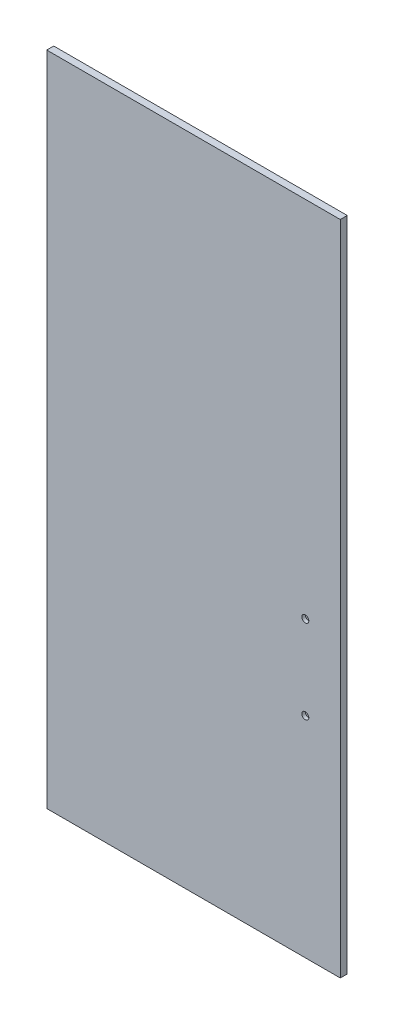
ISO-10303-21;
HEADER;
FILE_DESCRIPTION(('STEP AP214'),'2;1');
FILE_NAME('part.step','',(''),(''),'','','');
FILE_SCHEMA(('AUTOMOTIVE_DESIGN { 1 0 10303 214 1 1 1 1 }'));
ENDSEC;
DATA;
#1=APPLICATION_CONTEXT('core data for automotive mechanical design processes');
#2=APPLICATION_PROTOCOL_DEFINITION('international standard','automotive_design',2000,#1);
#3=PRODUCT_CONTEXT('',#1,'mechanical');
#4=PRODUCT('Part','Part','',(#3));
#5=PRODUCT_RELATED_PRODUCT_CATEGORY('part','',(#4));
#6=PRODUCT_DEFINITION_FORMATION('','',#4);
#7=PRODUCT_DEFINITION_CONTEXT('part definition',#1,'design');
#8=PRODUCT_DEFINITION('design','',#6,#7);
#9=PRODUCT_DEFINITION_SHAPE('','',#8);
#10=(LENGTH_UNIT() NAMED_UNIT(*) SI_UNIT(.MILLI.,.METRE.));
#11=(NAMED_UNIT(*) PLANE_ANGLE_UNIT() SI_UNIT($,.RADIAN.));
#12=(NAMED_UNIT(*) SI_UNIT($,.STERADIAN.) SOLID_ANGLE_UNIT());
#13=UNCERTAINTY_MEASURE_WITH_UNIT(LENGTH_MEASURE(1.E-05),#10,'distance_accuracy_value','');
#14=(GEOMETRIC_REPRESENTATION_CONTEXT(3) GLOBAL_UNCERTAINTY_ASSIGNED_CONTEXT((#13)) GLOBAL_UNIT_ASSIGNED_CONTEXT((#10,
#11,#12)) REPRESENTATION_CONTEXT('',''));
#15=CARTESIAN_POINT('',(0.,0.,0.));
#16=DIRECTION('',(0.,0.,1.));
#17=DIRECTION('',(1.,0.,0.));
#18=AXIS2_PLACEMENT_3D('',#15,#16,#17);
#19=CARTESIAN_POINT('',(0.,0.,10.));
#20=DIRECTION('',(1.,0.,0.));
#21=DIRECTION('',(0.,0.,-1.));
#22=AXIS2_PLACEMENT_3D('',#19,#20,#21);
#23=PLANE('',#22);
#24=DIRECTION('',(0.,-1.,0.));
#25=VECTOR('',#24,1.);
#26=CARTESIAN_POINT('',(0.,0.,0.));
#27=LINE('',#26,#25);
#28=CARTESIAN_POINT('',(0.,940.,0.));
#29=VERTEX_POINT('',#28);
#30=CARTESIAN_POINT('',(0.,0.,0.));
#31=VERTEX_POINT('',#30);
#32=EDGE_CURVE('E98',#29,#31,#27,.T.);
#33=ORIENTED_EDGE('',*,*,#32,.T.);
#34=DIRECTION('',(0.,0.,-1.));
#35=VECTOR('',#34,1.);
#36=CARTESIAN_POINT('',(0.,0.,10.));
#37=LINE('',#36,#35);
#38=CARTESIAN_POINT('',(0.,0.,10.));
#39=VERTEX_POINT('',#38);
#40=EDGE_CURVE('E11',#39,#31,#37,.T.);
#41=ORIENTED_EDGE('',*,*,#40,.F.);
#42=DIRECTION('',(0.,-1.,0.));
#43=VECTOR('',#42,1.);
#44=CARTESIAN_POINT('',(0.,0.,10.));
#45=LINE('',#44,#43);
#46=CARTESIAN_POINT('',(0.,940.,10.));
#47=VERTEX_POINT('',#46);
#48=EDGE_CURVE('E86',#47,#39,#45,.T.);
#49=ORIENTED_EDGE('',*,*,#48,.F.);
#50=DIRECTION('',(0.,0.,-1.));
#51=VECTOR('',#50,1.);
#52=CARTESIAN_POINT('',(0.,940.,10.));
#53=LINE('',#52,#51);
#54=EDGE_CURVE('E94',#47,#29,#53,.T.);
#55=ORIENTED_EDGE('',*,*,#54,.T.);
#56=EDGE_LOOP('',(#33,#41,#49,#55));
#57=FACE_BOUND('',#56,.T.);
#58=ADVANCED_FACE('F35',(#57),#23,.F.);
#59=CARTESIAN_POINT('',(0.,0.,10.));
#60=DIRECTION('',(0.,1.,0.));
#61=DIRECTION('',(0.,0.,1.));
#62=AXIS2_PLACEMENT_3D('',#59,#60,#61);
#63=PLANE('',#62);
#64=DIRECTION('',(1.,0.,0.));
#65=VECTOR('',#64,1.);
#66=CARTESIAN_POINT('',(0.,0.,0.));
#67=LINE('',#66,#65);
#68=CARTESIAN_POINT('',(420.,0.,0.));
#69=VERTEX_POINT('',#68);
#70=EDGE_CURVE('E90',#31,#69,#67,.T.);
#71=ORIENTED_EDGE('',*,*,#70,.T.);
#72=DIRECTION('',(0.,0.,-1.));
#73=VECTOR('',#72,1.);
#74=CARTESIAN_POINT('',(420.,0.,10.));
#75=LINE('',#74,#73);
#76=CARTESIAN_POINT('',(420.,0.,10.));
#77=VERTEX_POINT('',#76);
#78=EDGE_CURVE('E43',#77,#69,#75,.T.);
#79=ORIENTED_EDGE('',*,*,#78,.F.);
#80=DIRECTION('',(1.,0.,0.));
#81=VECTOR('',#80,1.);
#82=CARTESIAN_POINT('',(0.,0.,10.));
#83=LINE('',#82,#81);
#84=EDGE_CURVE('E81',#39,#77,#83,.T.);
#85=ORIENTED_EDGE('',*,*,#84,.F.);
#86=ORIENTED_EDGE('',*,*,#40,.T.);
#87=EDGE_LOOP('',(#71,#79,#85,#86));
#88=FACE_BOUND('',#87,.T.);
#89=ADVANCED_FACE('F89',(#88),#63,.F.);
#90=CARTESIAN_POINT('',(420.,0.,10.));
#91=DIRECTION('',(-1.,0.,0.));
#92=DIRECTION('',(0.,0.,1.));
#93=AXIS2_PLACEMENT_3D('',#90,#91,#92);
#94=PLANE('',#93);
#95=DIRECTION('',(0.,1.,0.));
#96=VECTOR('',#95,1.);
#97=CARTESIAN_POINT('',(420.,0.,0.));
#98=LINE('',#97,#96);
#99=CARTESIAN_POINT('',(420.,940.,0.));
#100=VERTEX_POINT('',#99);
#101=EDGE_CURVE('E68',#69,#100,#98,.T.);
#102=ORIENTED_EDGE('',*,*,#101,.T.);
#103=DIRECTION('',(0.,0.,-1.));
#104=VECTOR('',#103,1.);
#105=CARTESIAN_POINT('',(420.,940.,10.));
#106=LINE('',#105,#104);
#107=CARTESIAN_POINT('',(420.,940.,10.));
#108=VERTEX_POINT('',#107);
#109=EDGE_CURVE('E91',#108,#100,#106,.T.);
#110=ORIENTED_EDGE('',*,*,#109,.F.);
#111=DIRECTION('',(0.,1.,0.));
#112=VECTOR('',#111,1.);
#113=CARTESIAN_POINT('',(420.,0.,10.));
#114=LINE('',#113,#112);
#115=EDGE_CURVE('E84',#77,#108,#114,.T.);
#116=ORIENTED_EDGE('',*,*,#115,.F.);
#117=ORIENTED_EDGE('',*,*,#78,.T.);
#118=EDGE_LOOP('',(#102,#110,#116,#117));
#119=FACE_BOUND('',#118,.T.);
#120=ADVANCED_FACE('F92',(#119),#94,.F.);
#121=CARTESIAN_POINT('',(0.,940.,10.));
#122=DIRECTION('',(0.,-1.,0.));
#123=DIRECTION('',(0.,0.,-1.));
#124=AXIS2_PLACEMENT_3D('',#121,#122,#123);
#125=PLANE('',#124);
#126=DIRECTION('',(-1.,0.,0.));
#127=VECTOR('',#126,1.);
#128=CARTESIAN_POINT('',(0.,940.,0.));
#129=LINE('',#128,#127);
#130=EDGE_CURVE('E74',#100,#29,#129,.T.);
#131=ORIENTED_EDGE('',*,*,#130,.T.);
#132=ORIENTED_EDGE('',*,*,#54,.F.);
#133=DIRECTION('',(-1.,0.,0.));
#134=VECTOR('',#133,1.);
#135=CARTESIAN_POINT('',(0.,940.,10.));
#136=LINE('',#135,#134);
#137=EDGE_CURVE('E51',#108,#47,#136,.T.);
#138=ORIENTED_EDGE('',*,*,#137,.F.);
#139=ORIENTED_EDGE('',*,*,#109,.T.);
#140=EDGE_LOOP('',(#131,#132,#138,#139));
#141=FACE_BOUND('',#140,.T.);
#142=ADVANCED_FACE('F106',(#141),#125,.F.);
#143=CARTESIAN_POINT('',(0.,0.,10.));
#144=DIRECTION('',(0.,0.,-1.));
#145=DIRECTION('',(-1.,0.,0.));
#146=AXIS2_PLACEMENT_3D('',#143,#144,#145);
#147=PLANE('',#146);
#148=CARTESIAN_POINT('',(370.,300.,10.));
#149=DIRECTION('',(0.,0.,1.));
#150=DIRECTION('',(1.,0.,0.));
#151=AXIS2_PLACEMENT_3D('',#148,#149,#150);
#152=CIRCLE('',#151,4.99999999999999);
#153=CARTESIAN_POINT('',(375.,300.,10.));
#154=VERTEX_POINT('',#153);
#155=EDGE_CURVE('E118',#154,#154,#152,.T.);
#156=ORIENTED_EDGE('',*,*,#155,.F.);
#157=EDGE_LOOP('',(#156));
#158=FACE_BOUND('',#157,.T.);
#159=CARTESIAN_POINT('',(370.,420.,10.));
#160=DIRECTION('',(0.,0.,1.));
#161=DIRECTION('',(1.,0.,0.));
#162=AXIS2_PLACEMENT_3D('',#159,#160,#161);
#163=CIRCLE('',#162,4.99999999999999);
#164=CARTESIAN_POINT('',(375.,420.,10.));
#165=VERTEX_POINT('',#164);
#166=EDGE_CURVE('E112',#165,#165,#163,.T.);
#167=ORIENTED_EDGE('',*,*,#166,.F.);
#168=EDGE_LOOP('',(#167));
#169=FACE_BOUND('',#168,.T.);
#170=ORIENTED_EDGE('',*,*,#48,.T.);
#171=ORIENTED_EDGE('',*,*,#84,.T.);
#172=ORIENTED_EDGE('',*,*,#115,.T.);
#173=ORIENTED_EDGE('',*,*,#137,.T.);
#174=EDGE_LOOP('',(#170,#171,#172,#173));
#175=FACE_BOUND('',#174,.T.);
#176=ADVANCED_FACE('F82',(#158,#169,#175),#147,.F.);
#177=CARTESIAN_POINT('',(0.,0.,0.));
#178=DIRECTION('',(0.,0.,-1.));
#179=DIRECTION('',(-1.,0.,0.));
#180=AXIS2_PLACEMENT_3D('',#177,#178,#179);
#181=PLANE('',#180);
#182=ORIENTED_EDGE('',*,*,#32,.F.);
#183=ORIENTED_EDGE('',*,*,#130,.F.);
#184=ORIENTED_EDGE('',*,*,#101,.F.);
#185=ORIENTED_EDGE('',*,*,#70,.F.);
#186=EDGE_LOOP('',(#182,#183,#184,#185));
#187=FACE_BOUND('',#186,.T.);
#188=ADVANCED_FACE('F109',(#187),#181,.T.);
#189=CARTESIAN_POINT('',(370.,420.,5.));
#190=DIRECTION('',(0.,0.,1.));
#191=DIRECTION('',(1.,0.,0.));
#192=AXIS2_PLACEMENT_3D('',#189,#190,#191);
#193=CYLINDRICAL_SURFACE('',#192,4.99999999999999);
#194=CARTESIAN_POINT('',(370.,420.,5.));
#195=DIRECTION('',(0.,0.,1.));
#196=DIRECTION('',(1.,0.,0.));
#197=AXIS2_PLACEMENT_3D('',#194,#195,#196);
#198=CIRCLE('',#197,4.99999999999999);
#199=CARTESIAN_POINT('',(375.,420.,5.));
#200=VERTEX_POINT('',#199);
#201=EDGE_CURVE('E101',#200,#200,#198,.T.);
#202=ORIENTED_EDGE('',*,*,#201,.F.);
#203=EDGE_LOOP('',(#202));
#204=FACE_BOUND('',#203,.T.);
#205=ORIENTED_EDGE('',*,*,#166,.T.);
#206=EDGE_LOOP('',(#205));
#207=FACE_BOUND('',#206,.T.);
#208=ADVANCED_FACE('F138',(#204,#207),#193,.F.);
#209=CARTESIAN_POINT('',(370.,420.,5.));
#210=DIRECTION('',(0.,0.,1.));
#211=DIRECTION('',(1.,0.,0.));
#212=AXIS2_PLACEMENT_3D('',#209,#210,#211);
#213=PLANE('',#212);
#214=ORIENTED_EDGE('',*,*,#201,.T.);
#215=EDGE_LOOP('',(#214));
#216=FACE_BOUND('',#215,.T.);
#217=ADVANCED_FACE('F129',(#216),#213,.T.);
#218=CARTESIAN_POINT('',(370.,300.,5.));
#219=DIRECTION('',(0.,0.,1.));
#220=DIRECTION('',(1.,0.,0.));
#221=AXIS2_PLACEMENT_3D('',#218,#219,#220);
#222=CYLINDRICAL_SURFACE('',#221,4.99999999999999);
#223=CARTESIAN_POINT('',(370.,300.,5.));
#224=DIRECTION('',(0.,0.,1.));
#225=DIRECTION('',(1.,0.,0.));
#226=AXIS2_PLACEMENT_3D('',#223,#224,#225);
#227=CIRCLE('',#226,4.99999999999999);
#228=CARTESIAN_POINT('',(375.,300.,5.));
#229=VERTEX_POINT('',#228);
#230=EDGE_CURVE('E115',#229,#229,#227,.T.);
#231=ORIENTED_EDGE('',*,*,#230,.F.);
#232=EDGE_LOOP('',(#231));
#233=FACE_BOUND('',#232,.T.);
#234=ORIENTED_EDGE('',*,*,#155,.T.);
#235=EDGE_LOOP('',(#234));
#236=FACE_BOUND('',#235,.T.);
#237=ADVANCED_FACE('F126',(#233,#236),#222,.F.);
#238=CARTESIAN_POINT('',(370.,300.,5.));
#239=DIRECTION('',(0.,0.,1.));
#240=DIRECTION('',(1.,0.,0.));
#241=AXIS2_PLACEMENT_3D('',#238,#239,#240);
#242=PLANE('',#241);
#243=ORIENTED_EDGE('',*,*,#230,.T.);
#244=EDGE_LOOP('',(#243));
#245=FACE_BOUND('',#244,.T.);
#246=ADVANCED_FACE('F124',(#245),#242,.T.);
#247=CLOSED_SHELL('',(#58,#89,#120,#142,#176,#188,#208,#217,#237,#246));
#248=MANIFOLD_SOLID_BREP('B2',#247);
#249=ADVANCED_BREP_SHAPE_REPRESENTATION('',(#18,#248),#14);
#250=SHAPE_DEFINITION_REPRESENTATION(#9,#249);
ENDSEC;
END-ISO-10303-21;
